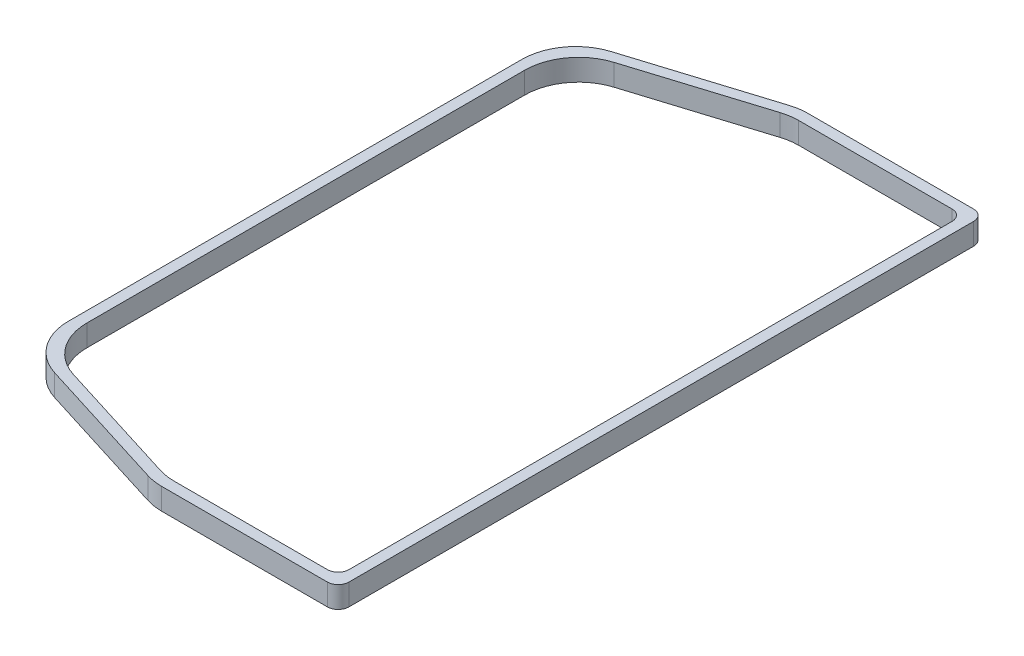
ISO-10303-21;
HEADER;
FILE_DESCRIPTION(('STEP AP214'),'2;1');
FILE_NAME('part.step','',(''),(''),'','','');
FILE_SCHEMA(('AUTOMOTIVE_DESIGN { 1 0 10303 214 1 1 1 1 }'));
ENDSEC;
DATA;
#1=APPLICATION_CONTEXT('core data for automotive mechanical design processes');
#2=APPLICATION_PROTOCOL_DEFINITION('international standard','automotive_design',2000,#1);
#3=PRODUCT_CONTEXT('',#1,'mechanical');
#4=PRODUCT('Part','Part','',(#3));
#5=PRODUCT_RELATED_PRODUCT_CATEGORY('part','',(#4));
#6=PRODUCT_DEFINITION_FORMATION('','',#4);
#7=PRODUCT_DEFINITION_CONTEXT('part definition',#1,'design');
#8=PRODUCT_DEFINITION('design','',#6,#7);
#9=PRODUCT_DEFINITION_SHAPE('','',#8);
#10=(LENGTH_UNIT() NAMED_UNIT(*) SI_UNIT(.MILLI.,.METRE.));
#11=(NAMED_UNIT(*) PLANE_ANGLE_UNIT() SI_UNIT($,.RADIAN.));
#12=(NAMED_UNIT(*) SI_UNIT($,.STERADIAN.) SOLID_ANGLE_UNIT());
#13=UNCERTAINTY_MEASURE_WITH_UNIT(LENGTH_MEASURE(1.E-05),#10,'distance_accuracy_value','');
#14=(GEOMETRIC_REPRESENTATION_CONTEXT(3) GLOBAL_UNCERTAINTY_ASSIGNED_CONTEXT((#13)) GLOBAL_UNIT_ASSIGNED_CONTEXT((#10,
#11,#12)) REPRESENTATION_CONTEXT('',''));
#15=CARTESIAN_POINT('',(0.,0.,0.));
#16=DIRECTION('',(0.,0.,1.));
#17=DIRECTION('',(1.,0.,0.));
#18=AXIS2_PLACEMENT_3D('',#15,#16,#17);
#19=CARTESIAN_POINT('',(1.,2.,0.));
#20=DIRECTION('',(-1.,0.,0.));
#21=DIRECTION('',(0.,0.,1.));
#22=AXIS2_PLACEMENT_3D('',#19,#20,#21);
#23=PLANE('',#22);
#24=DIRECTION('',(0.,0.,-1.));
#25=VECTOR('',#24,1.);
#26=CARTESIAN_POINT('',(1.,2.,0.));
#27=LINE('',#26,#25);
#28=CARTESIAN_POINT('',(1.,2.,29.));
#29=VERTEX_POINT('',#28);
#30=CARTESIAN_POINT('',(1.,2.,-29.));
#31=VERTEX_POINT('',#30);
#32=EDGE_CURVE('E228',#29,#31,#27,.T.);
#33=ORIENTED_EDGE('',*,*,#32,.F.);
#34=DIRECTION('',(0.,-1.,0.));
#35=VECTOR('',#34,1.);
#36=CARTESIAN_POINT('',(1.,0.,29.));
#37=LINE('',#36,#35);
#38=CARTESIAN_POINT('',(1.,0.,29.));
#39=VERTEX_POINT('',#38);
#40=EDGE_CURVE('E321',#29,#39,#37,.T.);
#41=ORIENTED_EDGE('',*,*,#40,.T.);
#42=DIRECTION('',(0.,0.,-1.));
#43=VECTOR('',#42,1.);
#44=CARTESIAN_POINT('',(1.,0.,0.));
#45=LINE('',#44,#43);
#46=CARTESIAN_POINT('',(1.,0.,-29.));
#47=VERTEX_POINT('',#46);
#48=EDGE_CURVE('E358',#39,#47,#45,.T.);
#49=ORIENTED_EDGE('',*,*,#48,.T.);
#50=DIRECTION('',(0.,-1.,0.));
#51=VECTOR('',#50,1.);
#52=CARTESIAN_POINT('',(1.,2.,-29.));
#53=LINE('',#52,#51);
#54=EDGE_CURVE('E271',#47,#31,#53,.F.);
#55=ORIENTED_EDGE('',*,*,#54,.T.);
#56=EDGE_LOOP('',(#33,#41,#49,#55));
#57=FACE_BOUND('',#56,.T.);
#58=ADVANCED_FACE('F35',(#57),#23,.F.);
#59=CARTESIAN_POINT('',(1.,2.,-30.));
#60=DIRECTION('',(0.,0.,1.));
#61=DIRECTION('',(1.,0.,0.));
#62=AXIS2_PLACEMENT_3D('',#59,#60,#61);
#63=PLANE('',#62);
#64=DIRECTION('',(-1.,0.,0.));
#65=VECTOR('',#64,1.);
#66=CARTESIAN_POINT('',(1.,2.,-30.));
#67=LINE('',#66,#65);
#68=CARTESIAN_POINT('',(0.,2.,-30.));
#69=VERTEX_POINT('',#68);
#70=CARTESIAN_POINT('',(-15.3895563086078,2.,-30.));
#71=VERTEX_POINT('',#70);
#72=EDGE_CURVE('E365',#69,#71,#67,.T.);
#73=ORIENTED_EDGE('',*,*,#72,.F.);
#74=DIRECTION('',(0.,-1.,0.));
#75=VECTOR('',#74,1.);
#76=CARTESIAN_POINT('',(0.,2.,-30.));
#77=LINE('',#76,#75);
#78=CARTESIAN_POINT('',(0.,0.,-30.));
#79=VERTEX_POINT('',#78);
#80=EDGE_CURVE('E265',#69,#79,#77,.T.);
#81=ORIENTED_EDGE('',*,*,#80,.T.);
#82=DIRECTION('',(-1.,0.,0.));
#83=VECTOR('',#82,1.);
#84=CARTESIAN_POINT('',(1.,0.,-30.));
#85=LINE('',#84,#83);
#86=CARTESIAN_POINT('',(-15.3895563086078,0.,-30.));
#87=VERTEX_POINT('',#86);
#88=EDGE_CURVE('E381',#79,#87,#85,.T.);
#89=ORIENTED_EDGE('',*,*,#88,.T.);
#90=DIRECTION('',(0.,-1.,0.));
#91=VECTOR('',#90,1.);
#92=CARTESIAN_POINT('',(-15.3895563086078,2.,-30.));
#93=LINE('',#92,#91);
#94=EDGE_CURVE('E247',#87,#71,#93,.F.);
#95=ORIENTED_EDGE('',*,*,#94,.T.);
#96=EDGE_LOOP('',(#73,#81,#89,#95));
#97=FACE_BOUND('',#96,.T.);
#98=ADVANCED_FACE('F412',(#97),#63,.F.);
#99=CARTESIAN_POINT('',(-16.152610922848,2.,-30.));
#100=DIRECTION('',(0.298274993135947,0.,0.95447997803503));
#101=DIRECTION('',(0.95447997803503,0.,-0.298274993135947));
#102=AXIS2_PLACEMENT_3D('',#99,#100,#101);
#103=PLANE('',#102);
#104=DIRECTION('',(-0.95447997803503,0.,0.298274993135947));
#105=VECTOR('',#104,1.);
#106=CARTESIAN_POINT('',(-16.152610922848,2.,-30.));
#107=LINE('',#106,#105);
#108=CARTESIAN_POINT('',(-16.8809312742876,2.,-29.7723998901751));
#109=VERTEX_POINT('',#108);
#110=CARTESIAN_POINT('',(-29.4913749656797,2.,-25.8316362366151));
#111=VERTEX_POINT('',#110);
#112=EDGE_CURVE('E367',#109,#111,#107,.T.);
#113=ORIENTED_EDGE('',*,*,#112,.F.);
#114=DIRECTION('',(0.,-1.,0.));
#115=VECTOR('',#114,1.);
#116=CARTESIAN_POINT('',(-16.8809312742876,2.,-29.7723998901751));
#117=LINE('',#116,#115);
#118=CARTESIAN_POINT('',(-16.8809312742876,0.,-29.7723998901751));
#119=VERTEX_POINT('',#118);
#120=EDGE_CURVE('E239',#109,#119,#117,.T.);
#121=ORIENTED_EDGE('',*,*,#120,.T.);
#122=DIRECTION('',(-0.95447997803503,0.,0.298274993135947));
#123=VECTOR('',#122,1.);
#124=CARTESIAN_POINT('',(-16.152610922848,0.,-30.));
#125=LINE('',#124,#123);
#126=CARTESIAN_POINT('',(-29.4913749656797,0.,-25.8316362366151));
#127=VERTEX_POINT('',#126);
#128=EDGE_CURVE('E383',#119,#127,#125,.T.);
#129=ORIENTED_EDGE('',*,*,#128,.T.);
#130=DIRECTION('',(0.,-1.,0.));
#131=VECTOR('',#130,1.);
#132=CARTESIAN_POINT('',(-29.4913749656797,2.,-25.8316362366151));
#133=LINE('',#132,#131);
#134=EDGE_CURVE('E237',#127,#111,#133,.F.);
#135=ORIENTED_EDGE('',*,*,#134,.T.);
#136=EDGE_LOOP('',(#113,#121,#129,#135));
#137=FACE_BOUND('',#136,.T.);
#138=ADVANCED_FACE('F418',(#137),#103,.F.);
#139=CARTESIAN_POINT('',(-33.,2.,-24.73519091339));
#140=DIRECTION('',(1.,0.,0.));
#141=DIRECTION('',(0.,0.,-1.));
#142=AXIS2_PLACEMENT_3D('',#139,#140,#141);
#143=PLANE('',#142);
#144=DIRECTION('',(0.,0.,1.));
#145=VECTOR('',#144,1.);
#146=CARTESIAN_POINT('',(-33.,0.,-24.73519091339));
#147=LINE('',#146,#145);
#148=CARTESIAN_POINT('',(-33.,0.,-21.0592363464399));
#149=VERTEX_POINT('',#148);
#150=CARTESIAN_POINT('',(-33.,0.,21.0592363464399));
#151=VERTEX_POINT('',#150);
#152=EDGE_CURVE('E386',#149,#151,#147,.T.);
#153=ORIENTED_EDGE('',*,*,#152,.T.);
#154=DIRECTION('',(0.,-1.,0.));
#155=VECTOR('',#154,1.);
#156=CARTESIAN_POINT('',(-33.,2.,21.0592363464399));
#157=LINE('',#156,#155);
#158=CARTESIAN_POINT('',(-33.,2.,21.0592363464399));
#159=VERTEX_POINT('',#158);
#160=EDGE_CURVE('E308',#151,#159,#157,.F.);
#161=ORIENTED_EDGE('',*,*,#160,.T.);
#162=DIRECTION('',(0.,0.,1.));
#163=VECTOR('',#162,1.);
#164=CARTESIAN_POINT('',(-33.,2.,-24.73519091339));
#165=LINE('',#164,#163);
#166=CARTESIAN_POINT('',(-33.,2.,-21.0592363464399));
#167=VERTEX_POINT('',#166);
#168=EDGE_CURVE('E370',#167,#159,#165,.T.);
#169=ORIENTED_EDGE('',*,*,#168,.F.);
#170=DIRECTION('',(0.,-1.,0.));
#171=VECTOR('',#170,1.);
#172=CARTESIAN_POINT('',(-33.,2.,-21.0592363464399));
#173=LINE('',#172,#171);
#174=EDGE_CURVE('E254',#167,#149,#173,.T.);
#175=ORIENTED_EDGE('',*,*,#174,.T.);
#176=EDGE_LOOP('',(#153,#161,#169,#175));
#177=FACE_BOUND('',#176,.T.);
#178=ADVANCED_FACE('F409',(#177),#143,.F.);
#179=CARTESIAN_POINT('',(-32.,2.,-24.));
#180=DIRECTION('',(-1.,0.,0.));
#181=DIRECTION('',(0.,0.,1.));
#182=AXIS2_PLACEMENT_3D('',#179,#180,#181);
#183=PLANE('',#182);
#184=DIRECTION('',(0.,0.,-1.));
#185=VECTOR('',#184,1.);
#186=CARTESIAN_POINT('',(-32.,2.,-24.));
#187=LINE('',#186,#185);
#188=CARTESIAN_POINT('',(-32.,2.,20.3240454330499));
#189=VERTEX_POINT('',#188);
#190=CARTESIAN_POINT('',(-32.,2.,-20.3240454330499));
#191=VERTEX_POINT('',#190);
#192=EDGE_CURVE('E373',#189,#191,#187,.T.);
#193=ORIENTED_EDGE('',*,*,#192,.F.);
#194=DIRECTION('',(0.,-1.,0.));
#195=VECTOR('',#194,1.);
#196=CARTESIAN_POINT('',(-32.,2.,20.3240454330499));
#197=LINE('',#196,#195);
#198=CARTESIAN_POINT('',(-32.,0.,20.3240454330499));
#199=VERTEX_POINT('',#198);
#200=EDGE_CURVE('E310',#189,#199,#197,.T.);
#201=ORIENTED_EDGE('',*,*,#200,.T.);
#202=DIRECTION('',(0.,0.,-1.));
#203=VECTOR('',#202,1.);
#204=CARTESIAN_POINT('',(-32.,0.,-24.));
#205=LINE('',#204,#203);
#206=CARTESIAN_POINT('',(-32.,0.,-20.3240454330499));
#207=VERTEX_POINT('',#206);
#208=EDGE_CURVE('E230',#199,#207,#205,.T.);
#209=ORIENTED_EDGE('',*,*,#208,.T.);
#210=DIRECTION('',(0.,-1.,0.));
#211=VECTOR('',#210,1.);
#212=CARTESIAN_POINT('',(-32.,2.,-20.3240454330499));
#213=LINE('',#212,#211);
#214=EDGE_CURVE('E208',#207,#191,#213,.F.);
#215=ORIENTED_EDGE('',*,*,#214,.T.);
#216=EDGE_LOOP('',(#193,#201,#209,#215));
#217=FACE_BOUND('',#216,.T.);
#218=ADVANCED_FACE('F391',(#217),#183,.F.);
#219=CARTESIAN_POINT('',(-16.,2.,-29.));
#220=DIRECTION('',(-0.298274993135947,0.,-0.95447997803503));
#221=DIRECTION('',(-0.95447997803503,0.,0.298274993135947));
#222=AXIS2_PLACEMENT_3D('',#219,#220,#221);
#223=PLANE('',#222);
#224=DIRECTION('',(0.95447997803503,0.,-0.298274993135947));
#225=VECTOR('',#224,1.);
#226=CARTESIAN_POINT('',(-16.,0.,-29.));
#227=LINE('',#226,#225);
#228=CARTESIAN_POINT('',(-28.4913749656797,0.,-25.0964453232251));
#229=VERTEX_POINT('',#228);
#230=CARTESIAN_POINT('',(-16.7283203514395,0.,-28.7723998901751));
#231=VERTEX_POINT('',#230);
#232=EDGE_CURVE('E226',#229,#231,#227,.T.);
#233=ORIENTED_EDGE('',*,*,#232,.T.);
#234=DIRECTION('',(0.,-1.,0.));
#235=VECTOR('',#234,1.);
#236=CARTESIAN_POINT('',(-16.7283203514395,2.,-28.7723998901751));
#237=LINE('',#236,#235);
#238=CARTESIAN_POINT('',(-16.7283203514395,2.,-28.7723998901751));
#239=VERTEX_POINT('',#238);
#240=EDGE_CURVE('E202',#231,#239,#237,.F.);
#241=ORIENTED_EDGE('',*,*,#240,.T.);
#242=DIRECTION('',(0.95447997803503,0.,-0.298274993135947));
#243=VECTOR('',#242,1.);
#244=CARTESIAN_POINT('',(-16.,2.,-29.));
#245=LINE('',#244,#243);
#246=CARTESIAN_POINT('',(-28.4913749656797,2.,-25.0964453232251));
#247=VERTEX_POINT('',#246);
#248=EDGE_CURVE('E375',#247,#239,#245,.T.);
#249=ORIENTED_EDGE('',*,*,#248,.F.);
#250=DIRECTION('',(0.,-1.,0.));
#251=VECTOR('',#250,1.);
#252=CARTESIAN_POINT('',(-28.4913749656797,0.,-25.0964453232251));
#253=LINE('',#252,#251);
#254=EDGE_CURVE('E218',#247,#229,#253,.T.);
#255=ORIENTED_EDGE('',*,*,#254,.T.);
#256=EDGE_LOOP('',(#233,#241,#249,#255));
#257=FACE_BOUND('',#256,.T.);
#258=ADVANCED_FACE('F401',(#257),#223,.F.);
#259=CARTESIAN_POINT('',(0.,2.,-29.));
#260=DIRECTION('',(0.,0.,-1.));
#261=DIRECTION('',(-1.,0.,0.));
#262=AXIS2_PLACEMENT_3D('',#259,#260,#261);
#263=PLANE('',#262);
#264=DIRECTION('',(1.,0.,0.));
#265=VECTOR('',#264,1.);
#266=CARTESIAN_POINT('',(0.,0.,-29.));
#267=LINE('',#266,#265);
#268=CARTESIAN_POINT('',(-15.2369453857598,0.,-29.));
#269=VERTEX_POINT('',#268);
#270=CARTESIAN_POINT('',(-1.,0.,-29.));
#271=VERTEX_POINT('',#270);
#272=EDGE_CURVE('E214',#269,#271,#267,.T.);
#273=ORIENTED_EDGE('',*,*,#272,.T.);
#274=DIRECTION('',(0.,-1.,0.));
#275=VECTOR('',#274,1.);
#276=CARTESIAN_POINT('',(-1.,2.,-29.));
#277=LINE('',#276,#275);
#278=CARTESIAN_POINT('',(-1.,2.,-29.));
#279=VERTEX_POINT('',#278);
#280=EDGE_CURVE('E279',#271,#279,#277,.F.);
#281=ORIENTED_EDGE('',*,*,#280,.T.);
#282=DIRECTION('',(1.,0.,0.));
#283=VECTOR('',#282,1.);
#284=CARTESIAN_POINT('',(0.,2.,-29.));
#285=LINE('',#284,#283);
#286=CARTESIAN_POINT('',(-15.2369453857598,2.,-29.));
#287=VERTEX_POINT('',#286);
#288=EDGE_CURVE('E217',#287,#279,#285,.T.);
#289=ORIENTED_EDGE('',*,*,#288,.F.);
#290=DIRECTION('',(0.,-1.,0.));
#291=VECTOR('',#290,1.);
#292=CARTESIAN_POINT('',(-15.2369453857598,0.,-29.));
#293=LINE('',#292,#291);
#294=EDGE_CURVE('E201',#287,#269,#293,.T.);
#295=ORIENTED_EDGE('',*,*,#294,.T.);
#296=EDGE_LOOP('',(#273,#281,#289,#295));
#297=FACE_BOUND('',#296,.T.);
#298=ADVANCED_FACE('F213',(#297),#263,.F.);
#299=CARTESIAN_POINT('',(0.,2.,0.));
#300=DIRECTION('',(1.,0.,0.));
#301=DIRECTION('',(0.,0.,-1.));
#302=AXIS2_PLACEMENT_3D('',#299,#300,#301);
#303=PLANE('',#302);
#304=DIRECTION('',(0.,0.,1.));
#305=VECTOR('',#304,1.);
#306=CARTESIAN_POINT('',(0.,0.,0.));
#307=LINE('',#306,#305);
#308=CARTESIAN_POINT('',(0.,0.,-28.));
#309=VERTEX_POINT('',#308);
#310=CARTESIAN_POINT('',(0.,0.,28.));
#311=VERTEX_POINT('',#310);
#312=EDGE_CURVE('E225',#309,#311,#307,.T.);
#313=ORIENTED_EDGE('',*,*,#312,.T.);
#314=DIRECTION('',(0.,-1.,0.));
#315=VECTOR('',#314,1.);
#316=CARTESIAN_POINT('',(0.,2.,28.));
#317=LINE('',#316,#315);
#318=CARTESIAN_POINT('',(0.,2.,28.));
#319=VERTEX_POINT('',#318);
#320=EDGE_CURVE('E56',#311,#319,#317,.F.);
#321=ORIENTED_EDGE('',*,*,#320,.T.);
#322=DIRECTION('',(0.,0.,1.));
#323=VECTOR('',#322,1.);
#324=CARTESIAN_POINT('',(0.,2.,0.));
#325=LINE('',#324,#323);
#326=CARTESIAN_POINT('',(0.,2.,-28.));
#327=VERTEX_POINT('',#326);
#328=EDGE_CURVE('E219',#327,#319,#325,.T.);
#329=ORIENTED_EDGE('',*,*,#328,.F.);
#330=DIRECTION('',(0.,-1.,0.));
#331=VECTOR('',#330,1.);
#332=CARTESIAN_POINT('',(0.,0.,-28.));
#333=LINE('',#332,#331);
#334=EDGE_CURVE('E276',#327,#309,#333,.T.);
#335=ORIENTED_EDGE('',*,*,#334,.T.);
#336=EDGE_LOOP('',(#313,#321,#329,#335));
#337=FACE_BOUND('',#336,.T.);
#338=ADVANCED_FACE('F338',(#337),#303,.F.);
#339=CARTESIAN_POINT('',(0.,2.,0.));
#340=DIRECTION('',(0.,-1.,0.));
#341=DIRECTION('',(0.,0.,-1.));
#342=AXIS2_PLACEMENT_3D('',#339,#340,#341);
#343=PLANE('',#342);
#344=DIRECTION('',(-1.,0.,0.));
#345=VECTOR('',#344,1.);
#346=CARTESIAN_POINT('',(1.,2.,30.));
#347=LINE('',#346,#345);
#348=CARTESIAN_POINT('',(0.,2.,30.));
#349=VERTEX_POINT('',#348);
#350=CARTESIAN_POINT('',(-15.3895563086078,2.,30.));
#351=VERTEX_POINT('',#350);
#352=EDGE_CURVE('E356',#349,#351,#347,.T.);
#353=ORIENTED_EDGE('',*,*,#352,.F.);
#354=CARTESIAN_POINT('',(0.,2.,29.));
#355=DIRECTION('',(0.,-1.,0.));
#356=DIRECTION('',(0.,0.,-1.));
#357=AXIS2_PLACEMENT_3D('',#354,#355,#356);
#358=CIRCLE('',#357,1.);
#359=EDGE_CURVE('E328',#349,#29,#358,.F.);
#360=ORIENTED_EDGE('',*,*,#359,.T.);
#361=ORIENTED_EDGE('',*,*,#32,.T.);
#362=CARTESIAN_POINT('',(0.,2.,-29.));
#363=DIRECTION('',(0.,-1.,0.));
#364=DIRECTION('',(0.,0.,-1.));
#365=AXIS2_PLACEMENT_3D('',#362,#363,#364);
#366=CIRCLE('',#365,1.);
#367=EDGE_CURVE('E274',#31,#69,#366,.F.);
#368=ORIENTED_EDGE('',*,*,#367,.T.);
#369=ORIENTED_EDGE('',*,*,#72,.T.);
#370=CARTESIAN_POINT('',(-15.3895563086078,2.,-25.));
#371=DIRECTION('',(0.,-1.,0.));
#372=DIRECTION('',(0.,0.,-1.));
#373=AXIS2_PLACEMENT_3D('',#370,#371,#372);
#374=CIRCLE('',#373,5.);
#375=EDGE_CURVE('E252',#71,#109,#374,.F.);
#376=ORIENTED_EDGE('',*,*,#375,.T.);
#377=ORIENTED_EDGE('',*,*,#112,.T.);
#378=CARTESIAN_POINT('',(-28.,2.,-21.0592363464399));
#379=DIRECTION('',(0.,-1.,0.));
#380=DIRECTION('',(0.,0.,-1.));
#381=AXIS2_PLACEMENT_3D('',#378,#379,#380);
#382=CIRCLE('',#381,5.);
#383=EDGE_CURVE('E250',#111,#167,#382,.F.);
#384=ORIENTED_EDGE('',*,*,#383,.T.);
#385=ORIENTED_EDGE('',*,*,#168,.T.);
#386=CARTESIAN_POINT('',(-28.,2.,21.0592363464399));
#387=DIRECTION('',(0.,-1.,0.));
#388=DIRECTION('',(0.,0.,-1.));
#389=AXIS2_PLACEMENT_3D('',#386,#387,#388);
#390=CIRCLE('',#389,5.);
#391=CARTESIAN_POINT('',(-29.4913749656797,2.,25.8316362366151));
#392=VERTEX_POINT('',#391);
#393=EDGE_CURVE('E303',#159,#392,#390,.F.);
#394=ORIENTED_EDGE('',*,*,#393,.T.);
#395=DIRECTION('',(-0.95447997803503,0.,-0.298274993135947));
#396=VECTOR('',#395,1.);
#397=CARTESIAN_POINT('',(-16.152610922848,2.,30.));
#398=LINE('',#397,#396);
#399=CARTESIAN_POINT('',(-16.8809312742876,2.,29.7723998901751));
#400=VERTEX_POINT('',#399);
#401=EDGE_CURVE('E349',#400,#392,#398,.T.);
#402=ORIENTED_EDGE('',*,*,#401,.F.);
#403=CARTESIAN_POINT('',(-15.3895563086078,2.,25.));
#404=DIRECTION('',(0.,-1.,0.));
#405=DIRECTION('',(0.,0.,-1.));
#406=AXIS2_PLACEMENT_3D('',#403,#404,#405);
#407=CIRCLE('',#406,5.);
#408=EDGE_CURVE('E305',#400,#351,#407,.F.);
#409=ORIENTED_EDGE('',*,*,#408,.T.);
#410=EDGE_LOOP('',(#353,#360,#361,#368,#369,#376,#377,#384,#385,#394,#402,#409));
#411=FACE_BOUND('',#410,.T.);
#412=ORIENTED_EDGE('',*,*,#328,.T.);
#413=CARTESIAN_POINT('',(-1.,2.,28.));
#414=DIRECTION('',(0.,-1.,0.));
#415=DIRECTION('',(0.,0.,-1.));
#416=AXIS2_PLACEMENT_3D('',#413,#414,#415);
#417=CIRCLE('',#416,1.);
#418=CARTESIAN_POINT('',(-1.,2.,29.));
#419=VERTEX_POINT('',#418);
#420=EDGE_CURVE('E11',#319,#419,#417,.T.);
#421=ORIENTED_EDGE('',*,*,#420,.T.);
#422=DIRECTION('',(1.,0.,0.));
#423=VECTOR('',#422,1.);
#424=CARTESIAN_POINT('',(0.,2.,29.));
#425=LINE('',#424,#423);
#426=CARTESIAN_POINT('',(-15.2369453857598,2.,29.));
#427=VERTEX_POINT('',#426);
#428=EDGE_CURVE('E343',#427,#419,#425,.T.);
#429=ORIENTED_EDGE('',*,*,#428,.F.);
#430=CARTESIAN_POINT('',(-15.2369453857598,2.,24.));
#431=DIRECTION('',(0.,-1.,0.));
#432=DIRECTION('',(0.,0.,-1.));
#433=AXIS2_PLACEMENT_3D('',#430,#431,#432);
#434=CIRCLE('',#433,5.);
#435=CARTESIAN_POINT('',(-16.7283203514395,2.,28.7723998901751));
#436=VERTEX_POINT('',#435);
#437=EDGE_CURVE('E315',#427,#436,#434,.T.);
#438=ORIENTED_EDGE('',*,*,#437,.T.);
#439=DIRECTION('',(0.95447997803503,0.,0.298274993135947));
#440=VECTOR('',#439,1.);
#441=CARTESIAN_POINT('',(-16.,2.,29.));
#442=LINE('',#441,#440);
#443=CARTESIAN_POINT('',(-28.4913749656797,2.,25.0964453232251));
#444=VERTEX_POINT('',#443);
#445=EDGE_CURVE('E345',#444,#436,#442,.T.);
#446=ORIENTED_EDGE('',*,*,#445,.F.);
#447=CARTESIAN_POINT('',(-27.,2.,20.3240454330499));
#448=DIRECTION('',(0.,-1.,0.));
#449=DIRECTION('',(0.,0.,-1.));
#450=AXIS2_PLACEMENT_3D('',#447,#448,#449);
#451=CIRCLE('',#450,5.);
#452=EDGE_CURVE('E319',#444,#189,#451,.T.);
#453=ORIENTED_EDGE('',*,*,#452,.T.);
#454=ORIENTED_EDGE('',*,*,#192,.T.);
#455=CARTESIAN_POINT('',(-27.,2.,-20.3240454330499));
#456=DIRECTION('',(0.,-1.,0.));
#457=DIRECTION('',(0.,0.,-1.));
#458=AXIS2_PLACEMENT_3D('',#455,#456,#457);
#459=CIRCLE('',#458,5.);
#460=EDGE_CURVE('E263',#191,#247,#459,.T.);
#461=ORIENTED_EDGE('',*,*,#460,.T.);
#462=ORIENTED_EDGE('',*,*,#248,.T.);
#463=CARTESIAN_POINT('',(-15.2369453857598,2.,-24.));
#464=DIRECTION('',(0.,-1.,0.));
#465=DIRECTION('',(0.,0.,-1.));
#466=AXIS2_PLACEMENT_3D('',#463,#464,#465);
#467=CIRCLE('',#466,5.);
#468=EDGE_CURVE('E207',#239,#287,#467,.T.);
#469=ORIENTED_EDGE('',*,*,#468,.T.);
#470=ORIENTED_EDGE('',*,*,#288,.T.);
#471=CARTESIAN_POINT('',(-1.,2.,-28.));
#472=DIRECTION('',(0.,-1.,0.));
#473=DIRECTION('',(0.,0.,-1.));
#474=AXIS2_PLACEMENT_3D('',#471,#472,#473);
#475=CIRCLE('',#474,1.);
#476=EDGE_CURVE('E282',#279,#327,#475,.T.);
#477=ORIENTED_EDGE('',*,*,#476,.T.);
#478=EDGE_LOOP('',(#412,#421,#429,#438,#446,#453,#454,#461,#462,#469,#470,#477));
#479=FACE_BOUND('',#478,.T.);
#480=ADVANCED_FACE('F399',(#411,#479),#343,.F.);
#481=CARTESIAN_POINT('',(0.,0.,0.));
#482=DIRECTION('',(0.,-1.,0.));
#483=DIRECTION('',(0.,0.,-1.));
#484=AXIS2_PLACEMENT_3D('',#481,#482,#483);
#485=PLANE('',#484);
#486=ORIENTED_EDGE('',*,*,#48,.F.);
#487=CARTESIAN_POINT('',(0.,0.,29.));
#488=DIRECTION('',(0.,-1.,0.));
#489=DIRECTION('',(0.,0.,-1.));
#490=AXIS2_PLACEMENT_3D('',#487,#488,#489);
#491=CIRCLE('',#490,1.);
#492=CARTESIAN_POINT('',(0.,0.,30.));
#493=VERTEX_POINT('',#492);
#494=EDGE_CURVE('E324',#39,#493,#491,.T.);
#495=ORIENTED_EDGE('',*,*,#494,.T.);
#496=DIRECTION('',(-1.,0.,0.));
#497=VECTOR('',#496,1.);
#498=CARTESIAN_POINT('',(1.,0.,30.));
#499=LINE('',#498,#497);
#500=CARTESIAN_POINT('',(-15.3895563086078,0.,30.));
#501=VERTEX_POINT('',#500);
#502=EDGE_CURVE('E346',#493,#501,#499,.T.);
#503=ORIENTED_EDGE('',*,*,#502,.T.);
#504=CARTESIAN_POINT('',(-15.3895563086078,0.,25.));
#505=DIRECTION('',(0.,-1.,0.));
#506=DIRECTION('',(0.,0.,-1.));
#507=AXIS2_PLACEMENT_3D('',#504,#505,#506);
#508=CIRCLE('',#507,5.);
#509=CARTESIAN_POINT('',(-16.8809312742876,0.,29.7723998901751));
#510=VERTEX_POINT('',#509);
#511=EDGE_CURVE('E296',#501,#510,#508,.T.);
#512=ORIENTED_EDGE('',*,*,#511,.T.);
#513=DIRECTION('',(-0.95447997803503,0.,-0.298274993135947));
#514=VECTOR('',#513,1.);
#515=CARTESIAN_POINT('',(-16.152610922848,0.,30.));
#516=LINE('',#515,#514);
#517=CARTESIAN_POINT('',(-29.4913749656797,0.,25.8316362366151));
#518=VERTEX_POINT('',#517);
#519=EDGE_CURVE('E351',#510,#518,#516,.T.);
#520=ORIENTED_EDGE('',*,*,#519,.T.);
#521=CARTESIAN_POINT('',(-28.,0.,21.0592363464399));
#522=DIRECTION('',(0.,-1.,0.));
#523=DIRECTION('',(0.,0.,-1.));
#524=AXIS2_PLACEMENT_3D('',#521,#522,#523);
#525=CIRCLE('',#524,5.);
#526=EDGE_CURVE('E294',#518,#151,#525,.T.);
#527=ORIENTED_EDGE('',*,*,#526,.T.);
#528=ORIENTED_EDGE('',*,*,#152,.F.);
#529=CARTESIAN_POINT('',(-28.,0.,-21.0592363464399));
#530=DIRECTION('',(0.,-1.,0.));
#531=DIRECTION('',(0.,0.,-1.));
#532=AXIS2_PLACEMENT_3D('',#529,#530,#531);
#533=CIRCLE('',#532,5.);
#534=EDGE_CURVE('E242',#149,#127,#533,.T.);
#535=ORIENTED_EDGE('',*,*,#534,.T.);
#536=ORIENTED_EDGE('',*,*,#128,.F.);
#537=CARTESIAN_POINT('',(-15.3895563086078,0.,-25.));
#538=DIRECTION('',(0.,-1.,0.));
#539=DIRECTION('',(0.,0.,-1.));
#540=AXIS2_PLACEMENT_3D('',#537,#538,#539);
#541=CIRCLE('',#540,5.);
#542=EDGE_CURVE('E244',#119,#87,#541,.T.);
#543=ORIENTED_EDGE('',*,*,#542,.T.);
#544=ORIENTED_EDGE('',*,*,#88,.F.);
#545=CARTESIAN_POINT('',(0.,0.,-29.));
#546=DIRECTION('',(0.,-1.,0.));
#547=DIRECTION('',(0.,0.,-1.));
#548=AXIS2_PLACEMENT_3D('',#545,#546,#547);
#549=CIRCLE('',#548,1.);
#550=EDGE_CURVE('E268',#79,#47,#549,.T.);
#551=ORIENTED_EDGE('',*,*,#550,.T.);
#552=EDGE_LOOP('',(#486,#495,#503,#512,#520,#527,#528,#535,#536,#543,#544,#551));
#553=FACE_BOUND('',#552,.T.);
#554=DIRECTION('',(0.95447997803503,0.,0.298274993135947));
#555=VECTOR('',#554,1.);
#556=CARTESIAN_POINT('',(-16.,0.,29.));
#557=LINE('',#556,#555);
#558=CARTESIAN_POINT('',(-28.4913749656797,0.,25.0964453232251));
#559=VERTEX_POINT('',#558);
#560=CARTESIAN_POINT('',(-16.7283203514395,0.,28.7723998901751));
#561=VERTEX_POINT('',#560);
#562=EDGE_CURVE('E360',#559,#561,#557,.T.);
#563=ORIENTED_EDGE('',*,*,#562,.T.);
#564=CARTESIAN_POINT('',(-15.2369453857598,0.,24.));
#565=DIRECTION('',(0.,-1.,0.));
#566=DIRECTION('',(0.,0.,-1.));
#567=AXIS2_PLACEMENT_3D('',#564,#565,#566);
#568=CIRCLE('',#567,5.);
#569=CARTESIAN_POINT('',(-15.2369453857598,0.,29.));
#570=VERTEX_POINT('',#569);
#571=EDGE_CURVE('E313',#561,#570,#568,.F.);
#572=ORIENTED_EDGE('',*,*,#571,.T.);
#573=DIRECTION('',(1.,0.,0.));
#574=VECTOR('',#573,1.);
#575=CARTESIAN_POINT('',(0.,0.,29.));
#576=LINE('',#575,#574);
#577=CARTESIAN_POINT('',(-1.,0.,29.));
#578=VERTEX_POINT('',#577);
#579=EDGE_CURVE('E335',#570,#578,#576,.T.);
#580=ORIENTED_EDGE('',*,*,#579,.T.);
#581=CARTESIAN_POINT('',(-1.,0.,28.));
#582=DIRECTION('',(0.,-1.,0.));
#583=DIRECTION('',(0.,0.,-1.));
#584=AXIS2_PLACEMENT_3D('',#581,#582,#583);
#585=CIRCLE('',#584,1.);
#586=EDGE_CURVE('E43',#578,#311,#585,.F.);
#587=ORIENTED_EDGE('',*,*,#586,.T.);
#588=ORIENTED_EDGE('',*,*,#312,.F.);
#589=CARTESIAN_POINT('',(-1.,0.,-28.));
#590=DIRECTION('',(0.,-1.,0.));
#591=DIRECTION('',(0.,0.,-1.));
#592=AXIS2_PLACEMENT_3D('',#589,#590,#591);
#593=CIRCLE('',#592,1.);
#594=EDGE_CURVE('E224',#309,#271,#593,.F.);
#595=ORIENTED_EDGE('',*,*,#594,.T.);
#596=ORIENTED_EDGE('',*,*,#272,.F.);
#597=CARTESIAN_POINT('',(-15.2369453857598,0.,-24.));
#598=DIRECTION('',(0.,-1.,0.));
#599=DIRECTION('',(0.,0.,-1.));
#600=AXIS2_PLACEMENT_3D('',#597,#598,#599);
#601=CIRCLE('',#600,5.);
#602=EDGE_CURVE('E197',#269,#231,#601,.F.);
#603=ORIENTED_EDGE('',*,*,#602,.T.);
#604=ORIENTED_EDGE('',*,*,#232,.F.);
#605=CARTESIAN_POINT('',(-27.,0.,-20.3240454330499));
#606=DIRECTION('',(0.,-1.,0.));
#607=DIRECTION('',(0.,0.,-1.));
#608=AXIS2_PLACEMENT_3D('',#605,#606,#607);
#609=CIRCLE('',#608,5.);
#610=EDGE_CURVE('E260',#229,#207,#609,.F.);
#611=ORIENTED_EDGE('',*,*,#610,.T.);
#612=ORIENTED_EDGE('',*,*,#208,.F.);
#613=CARTESIAN_POINT('',(-27.,0.,20.3240454330499));
#614=DIRECTION('',(0.,-1.,0.));
#615=DIRECTION('',(0.,0.,-1.));
#616=AXIS2_PLACEMENT_3D('',#613,#614,#615);
#617=CIRCLE('',#616,5.);
#618=EDGE_CURVE('E317',#199,#559,#617,.F.);
#619=ORIENTED_EDGE('',*,*,#618,.T.);
#620=EDGE_LOOP('',(#563,#572,#580,#587,#588,#595,#596,#603,#604,#611,#612,#619));
#621=FACE_BOUND('',#620,.T.);
#622=ADVANCED_FACE('F222',(#553,#621),#485,.T.);
#623=CARTESIAN_POINT('',(-15.2369453857598,2.,-24.));
#624=DIRECTION('',(0.,1.,0.));
#625=DIRECTION('',(0.,0.,1.));
#626=AXIS2_PLACEMENT_3D('',#623,#624,#625);
#627=CYLINDRICAL_SURFACE('',#626,5.);
#628=ORIENTED_EDGE('',*,*,#468,.F.);
#629=ORIENTED_EDGE('',*,*,#240,.F.);
#630=ORIENTED_EDGE('',*,*,#602,.F.);
#631=ORIENTED_EDGE('',*,*,#294,.F.);
#632=EDGE_LOOP('',(#628,#629,#630,#631));
#633=FACE_BOUND('',#632,.T.);
#634=ADVANCED_FACE('F200',(#633),#627,.F.);
#635=CARTESIAN_POINT('',(-15.3895563086078,2.,-25.));
#636=DIRECTION('',(0.,-1.,0.));
#637=DIRECTION('',(0.,0.,-1.));
#638=AXIS2_PLACEMENT_3D('',#635,#636,#637);
#639=CYLINDRICAL_SURFACE('',#638,5.);
#640=ORIENTED_EDGE('',*,*,#375,.F.);
#641=ORIENTED_EDGE('',*,*,#94,.F.);
#642=ORIENTED_EDGE('',*,*,#542,.F.);
#643=ORIENTED_EDGE('',*,*,#120,.F.);
#644=EDGE_LOOP('',(#640,#641,#642,#643));
#645=FACE_BOUND('',#644,.T.);
#646=ADVANCED_FACE('F426',(#645),#639,.T.);
#647=CARTESIAN_POINT('',(-28.,2.,-21.0592363464399));
#648=DIRECTION('',(0.,-1.,0.));
#649=DIRECTION('',(0.,0.,-1.));
#650=AXIS2_PLACEMENT_3D('',#647,#648,#649);
#651=CYLINDRICAL_SURFACE('',#650,5.);
#652=ORIENTED_EDGE('',*,*,#383,.F.);
#653=ORIENTED_EDGE('',*,*,#134,.F.);
#654=ORIENTED_EDGE('',*,*,#534,.F.);
#655=ORIENTED_EDGE('',*,*,#174,.F.);
#656=EDGE_LOOP('',(#652,#653,#654,#655));
#657=FACE_BOUND('',#656,.T.);
#658=ADVANCED_FACE('F429',(#657),#651,.T.);
#659=CARTESIAN_POINT('',(-27.,2.,-20.3240454330499));
#660=DIRECTION('',(0.,1.,0.));
#661=DIRECTION('',(0.,0.,1.));
#662=AXIS2_PLACEMENT_3D('',#659,#660,#661);
#663=CYLINDRICAL_SURFACE('',#662,5.);
#664=ORIENTED_EDGE('',*,*,#460,.F.);
#665=ORIENTED_EDGE('',*,*,#214,.F.);
#666=ORIENTED_EDGE('',*,*,#610,.F.);
#667=ORIENTED_EDGE('',*,*,#254,.F.);
#668=EDGE_LOOP('',(#664,#665,#666,#667));
#669=FACE_BOUND('',#668,.T.);
#670=ADVANCED_FACE('F397',(#669),#663,.F.);
#671=CARTESIAN_POINT('',(0.,2.,-29.));
#672=DIRECTION('',(0.,-1.,0.));
#673=DIRECTION('',(0.,0.,-1.));
#674=AXIS2_PLACEMENT_3D('',#671,#672,#673);
#675=CYLINDRICAL_SURFACE('',#674,1.);
#676=ORIENTED_EDGE('',*,*,#367,.F.);
#677=ORIENTED_EDGE('',*,*,#54,.F.);
#678=ORIENTED_EDGE('',*,*,#550,.F.);
#679=ORIENTED_EDGE('',*,*,#80,.F.);
#680=EDGE_LOOP('',(#676,#677,#678,#679));
#681=FACE_BOUND('',#680,.T.);
#682=ADVANCED_FACE('F436',(#681),#675,.T.);
#683=CARTESIAN_POINT('',(-1.,2.,-28.));
#684=DIRECTION('',(0.,1.,0.));
#685=DIRECTION('',(0.,0.,1.));
#686=AXIS2_PLACEMENT_3D('',#683,#684,#685);
#687=CYLINDRICAL_SURFACE('',#686,1.);
#688=ORIENTED_EDGE('',*,*,#476,.F.);
#689=ORIENTED_EDGE('',*,*,#280,.F.);
#690=ORIENTED_EDGE('',*,*,#594,.F.);
#691=ORIENTED_EDGE('',*,*,#334,.F.);
#692=EDGE_LOOP('',(#688,#689,#690,#691));
#693=FACE_BOUND('',#692,.T.);
#694=ADVANCED_FACE('F439',(#693),#687,.F.);
#695=CARTESIAN_POINT('',(0.,2.,29.));
#696=DIRECTION('',(0.,0.,-1.));
#697=DIRECTION('',(-1.,0.,0.));
#698=AXIS2_PLACEMENT_3D('',#695,#696,#697);
#699=PLANE('',#698);
#700=ORIENTED_EDGE('',*,*,#428,.T.);
#701=DIRECTION('',(0.,-1.,0.));
#702=VECTOR('',#701,1.);
#703=CARTESIAN_POINT('',(-1.,2.,29.));
#704=LINE('',#703,#702);
#705=EDGE_CURVE('E330',#419,#578,#704,.T.);
#706=ORIENTED_EDGE('',*,*,#705,.T.);
#707=ORIENTED_EDGE('',*,*,#579,.F.);
#708=DIRECTION('',(0.,-1.,0.));
#709=VECTOR('',#708,1.);
#710=CARTESIAN_POINT('',(-15.2369453857598,2.,29.));
#711=LINE('',#710,#709);
#712=EDGE_CURVE('E289',#570,#427,#711,.F.);
#713=ORIENTED_EDGE('',*,*,#712,.T.);
#714=EDGE_LOOP('',(#700,#706,#707,#713));
#715=FACE_BOUND('',#714,.T.);
#716=ADVANCED_FACE('F341',(#715),#699,.T.);
#717=CARTESIAN_POINT('',(-16.,2.,29.));
#718=DIRECTION('',(0.298274993135947,0.,-0.95447997803503));
#719=DIRECTION('',(-0.95447997803503,0.,-0.298274993135947));
#720=AXIS2_PLACEMENT_3D('',#717,#718,#719);
#721=PLANE('',#720);
#722=ORIENTED_EDGE('',*,*,#445,.T.);
#723=DIRECTION('',(0.,-1.,0.));
#724=VECTOR('',#723,1.);
#725=CARTESIAN_POINT('',(-16.7283203514395,0.,28.7723998901751));
#726=LINE('',#725,#724);
#727=EDGE_CURVE('E286',#436,#561,#726,.T.);
#728=ORIENTED_EDGE('',*,*,#727,.T.);
#729=ORIENTED_EDGE('',*,*,#562,.F.);
#730=DIRECTION('',(0.,-1.,0.));
#731=VECTOR('',#730,1.);
#732=CARTESIAN_POINT('',(-28.4913749656797,2.,25.0964453232251));
#733=LINE('',#732,#731);
#734=EDGE_CURVE('E284',#559,#444,#733,.F.);
#735=ORIENTED_EDGE('',*,*,#734,.T.);
#736=EDGE_LOOP('',(#722,#728,#729,#735));
#737=FACE_BOUND('',#736,.T.);
#738=ADVANCED_FACE('F536',(#737),#721,.T.);
#739=CARTESIAN_POINT('',(-16.152610922848,2.,30.));
#740=DIRECTION('',(-0.298274993135947,0.,0.95447997803503));
#741=DIRECTION('',(0.95447997803503,0.,0.298274993135947));
#742=AXIS2_PLACEMENT_3D('',#739,#740,#741);
#743=PLANE('',#742);
#744=ORIENTED_EDGE('',*,*,#519,.F.);
#745=DIRECTION('',(0.,-1.,0.));
#746=VECTOR('',#745,1.);
#747=CARTESIAN_POINT('',(-16.8809312742876,2.,29.7723998901751));
#748=LINE('',#747,#746);
#749=EDGE_CURVE('E301',#510,#400,#748,.F.);
#750=ORIENTED_EDGE('',*,*,#749,.T.);
#751=ORIENTED_EDGE('',*,*,#401,.T.);
#752=DIRECTION('',(0.,-1.,0.));
#753=VECTOR('',#752,1.);
#754=CARTESIAN_POINT('',(-29.4913749656797,0.,25.8316362366151));
#755=LINE('',#754,#753);
#756=EDGE_CURVE('E298',#392,#518,#755,.T.);
#757=ORIENTED_EDGE('',*,*,#756,.T.);
#758=EDGE_LOOP('',(#744,#750,#751,#757));
#759=FACE_BOUND('',#758,.T.);
#760=ADVANCED_FACE('F496',(#759),#743,.T.);
#761=CARTESIAN_POINT('',(1.,2.,30.));
#762=DIRECTION('',(0.,0.,1.));
#763=DIRECTION('',(1.,0.,0.));
#764=AXIS2_PLACEMENT_3D('',#761,#762,#763);
#765=PLANE('',#764);
#766=ORIENTED_EDGE('',*,*,#502,.F.);
#767=DIRECTION('',(0.,-1.,0.));
#768=VECTOR('',#767,1.);
#769=CARTESIAN_POINT('',(0.,2.,30.));
#770=LINE('',#769,#768);
#771=EDGE_CURVE('E326',#493,#349,#770,.F.);
#772=ORIENTED_EDGE('',*,*,#771,.T.);
#773=ORIENTED_EDGE('',*,*,#352,.T.);
#774=DIRECTION('',(0.,-1.,0.));
#775=VECTOR('',#774,1.);
#776=CARTESIAN_POINT('',(-15.3895563086078,2.,30.));
#777=LINE('',#776,#775);
#778=EDGE_CURVE('E291',#351,#501,#777,.T.);
#779=ORIENTED_EDGE('',*,*,#778,.T.);
#780=EDGE_LOOP('',(#766,#772,#773,#779));
#781=FACE_BOUND('',#780,.T.);
#782=ADVANCED_FACE('F448',(#781),#765,.T.);
#783=CARTESIAN_POINT('',(-15.2369453857598,2.,24.));
#784=DIRECTION('',(0.,1.,0.));
#785=DIRECTION('',(0.,0.,1.));
#786=AXIS2_PLACEMENT_3D('',#783,#784,#785);
#787=CYLINDRICAL_SURFACE('',#786,5.);
#788=ORIENTED_EDGE('',*,*,#437,.F.);
#789=ORIENTED_EDGE('',*,*,#712,.F.);
#790=ORIENTED_EDGE('',*,*,#571,.F.);
#791=ORIENTED_EDGE('',*,*,#727,.F.);
#792=EDGE_LOOP('',(#788,#789,#790,#791));
#793=FACE_BOUND('',#792,.T.);
#794=ADVANCED_FACE('F444',(#793),#787,.F.);
#795=CARTESIAN_POINT('',(-15.3895563086078,2.,25.));
#796=DIRECTION('',(0.,-1.,0.));
#797=DIRECTION('',(0.,0.,-1.));
#798=AXIS2_PLACEMENT_3D('',#795,#796,#797);
#799=CYLINDRICAL_SURFACE('',#798,5.);
#800=ORIENTED_EDGE('',*,*,#408,.F.);
#801=ORIENTED_EDGE('',*,*,#749,.F.);
#802=ORIENTED_EDGE('',*,*,#511,.F.);
#803=ORIENTED_EDGE('',*,*,#778,.F.);
#804=EDGE_LOOP('',(#800,#801,#802,#803));
#805=FACE_BOUND('',#804,.T.);
#806=ADVANCED_FACE('F447',(#805),#799,.T.);
#807=CARTESIAN_POINT('',(-28.,2.,21.0592363464399));
#808=DIRECTION('',(0.,1.,0.));
#809=DIRECTION('',(0.,0.,1.));
#810=AXIS2_PLACEMENT_3D('',#807,#808,#809);
#811=CYLINDRICAL_SURFACE('',#810,5.);
#812=ORIENTED_EDGE('',*,*,#393,.F.);
#813=ORIENTED_EDGE('',*,*,#160,.F.);
#814=ORIENTED_EDGE('',*,*,#526,.F.);
#815=ORIENTED_EDGE('',*,*,#756,.F.);
#816=EDGE_LOOP('',(#812,#813,#814,#815));
#817=FACE_BOUND('',#816,.T.);
#818=ADVANCED_FACE('F452',(#817),#811,.T.);
#819=CARTESIAN_POINT('',(-27.,2.,20.3240454330499));
#820=DIRECTION('',(0.,-1.,0.));
#821=DIRECTION('',(0.,0.,-1.));
#822=AXIS2_PLACEMENT_3D('',#819,#820,#821);
#823=CYLINDRICAL_SURFACE('',#822,5.);
#824=ORIENTED_EDGE('',*,*,#452,.F.);
#825=ORIENTED_EDGE('',*,*,#734,.F.);
#826=ORIENTED_EDGE('',*,*,#618,.F.);
#827=ORIENTED_EDGE('',*,*,#200,.F.);
#828=EDGE_LOOP('',(#824,#825,#826,#827));
#829=FACE_BOUND('',#828,.T.);
#830=ADVANCED_FACE('F456',(#829),#823,.F.);
#831=CARTESIAN_POINT('',(0.,2.,29.));
#832=DIRECTION('',(0.,1.,0.));
#833=DIRECTION('',(0.,0.,1.));
#834=AXIS2_PLACEMENT_3D('',#831,#832,#833);
#835=CYLINDRICAL_SURFACE('',#834,1.);
#836=ORIENTED_EDGE('',*,*,#359,.F.);
#837=ORIENTED_EDGE('',*,*,#771,.F.);
#838=ORIENTED_EDGE('',*,*,#494,.F.);
#839=ORIENTED_EDGE('',*,*,#40,.F.);
#840=EDGE_LOOP('',(#836,#837,#838,#839));
#841=FACE_BOUND('',#840,.T.);
#842=ADVANCED_FACE('F459',(#841),#835,.T.);
#843=CARTESIAN_POINT('',(-1.,2.,28.));
#844=DIRECTION('',(0.,-1.,0.));
#845=DIRECTION('',(0.,0.,-1.));
#846=AXIS2_PLACEMENT_3D('',#843,#844,#845);
#847=CYLINDRICAL_SURFACE('',#846,1.);
#848=ORIENTED_EDGE('',*,*,#420,.F.);
#849=ORIENTED_EDGE('',*,*,#320,.F.);
#850=ORIENTED_EDGE('',*,*,#586,.F.);
#851=ORIENTED_EDGE('',*,*,#705,.F.);
#852=EDGE_LOOP('',(#848,#849,#850,#851));
#853=FACE_BOUND('',#852,.T.);
#854=ADVANCED_FACE('F37',(#853),#847,.F.);
#855=CLOSED_SHELL('',(#58,#98,#138,#178,#218,#258,#298,#338,#480,#622,#634,#646,#658,#670,#682,
#694,#716,#738,#760,#782,#794,#806,#818,#830,#842,#854));
#856=MANIFOLD_SOLID_BREP('B2',#855);
#857=ADVANCED_BREP_SHAPE_REPRESENTATION('',(#18,#856),#14);
#858=SHAPE_DEFINITION_REPRESENTATION(#9,#857);
ENDSEC;
END-ISO-10303-21;
